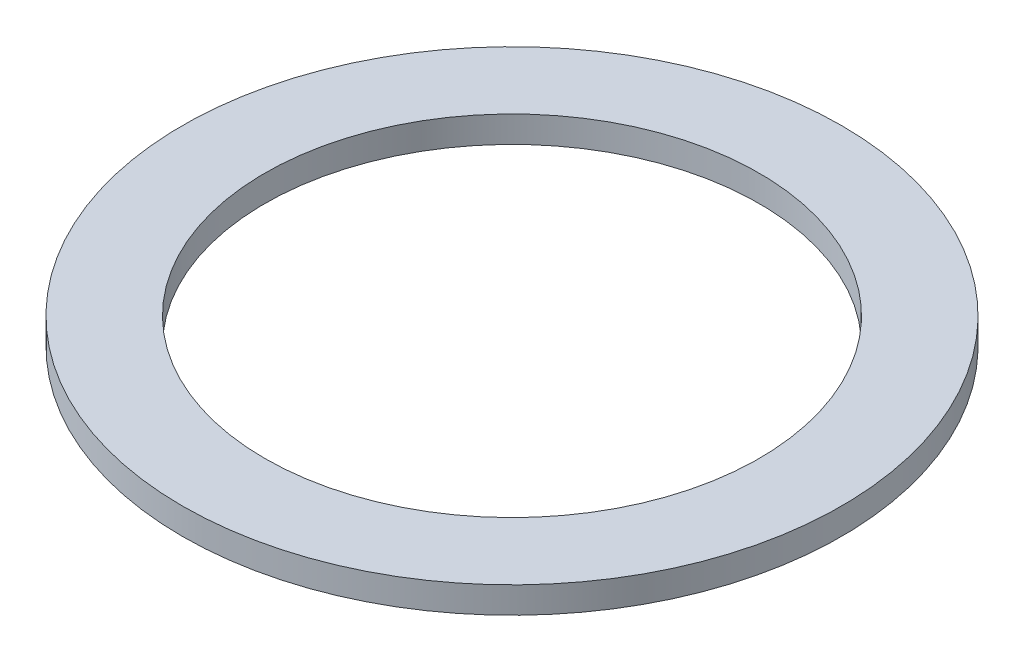
ISO-10303-21;
HEADER;
FILE_DESCRIPTION(('STEP AP214'),'2;1');
FILE_NAME('part.step','',(''),(''),'','','');
FILE_SCHEMA(('AUTOMOTIVE_DESIGN { 1 0 10303 214 1 1 1 1 }'));
ENDSEC;
DATA;
#1=APPLICATION_CONTEXT('core data for automotive mechanical design processes');
#2=APPLICATION_PROTOCOL_DEFINITION('international standard','automotive_design',2000,#1);
#3=PRODUCT_CONTEXT('',#1,'mechanical');
#4=PRODUCT('Part','Part','',(#3));
#5=PRODUCT_RELATED_PRODUCT_CATEGORY('part','',(#4));
#6=PRODUCT_DEFINITION_FORMATION('','',#4);
#7=PRODUCT_DEFINITION_CONTEXT('part definition',#1,'design');
#8=PRODUCT_DEFINITION('design','',#6,#7);
#9=PRODUCT_DEFINITION_SHAPE('','',#8);
#10=(LENGTH_UNIT() NAMED_UNIT(*) SI_UNIT(.MILLI.,.METRE.));
#11=(NAMED_UNIT(*) PLANE_ANGLE_UNIT() SI_UNIT($,.RADIAN.));
#12=(NAMED_UNIT(*) SI_UNIT($,.STERADIAN.) SOLID_ANGLE_UNIT());
#13=UNCERTAINTY_MEASURE_WITH_UNIT(LENGTH_MEASURE(1.E-05),#10,'distance_accuracy_value','');
#14=(GEOMETRIC_REPRESENTATION_CONTEXT(3) GLOBAL_UNCERTAINTY_ASSIGNED_CONTEXT((#13)) GLOBAL_UNIT_ASSIGNED_CONTEXT((#10,
#11,#12)) REPRESENTATION_CONTEXT('',''));
#15=CARTESIAN_POINT('',(0.,0.,0.));
#16=DIRECTION('',(0.,0.,1.));
#17=DIRECTION('',(1.,0.,0.));
#18=AXIS2_PLACEMENT_3D('',#15,#16,#17);
#19=CARTESIAN_POINT('',(0.,4.,0.));
#20=DIRECTION('',(0.,1.,0.));
#21=DIRECTION('',(0.,0.,1.));
#22=AXIS2_PLACEMENT_3D('',#19,#20,#21);
#23=PLANE('',#22);
#24=CARTESIAN_POINT('',(0.,4.,0.));
#25=DIRECTION('',(0.,1.,0.));
#26=DIRECTION('',(0.,0.,1.));
#27=AXIS2_PLACEMENT_3D('',#24,#25,#26);
#28=CIRCLE('',#27,50.);
#29=CARTESIAN_POINT('',(0.,4.,50.));
#30=VERTEX_POINT('',#29);
#31=EDGE_CURVE('E10',#30,#30,#28,.T.);
#32=ORIENTED_EDGE('',*,*,#31,.T.);
#33=EDGE_LOOP('',(#32));
#34=FACE_BOUND('',#33,.T.);
#35=CARTESIAN_POINT('',(0.,4.,0.));
#36=DIRECTION('',(0.,1.,0.));
#37=DIRECTION('',(0.,0.,1.));
#38=AXIS2_PLACEMENT_3D('',#35,#36,#37);
#39=CIRCLE('',#38,37.5);
#40=CARTESIAN_POINT('',(0.,4.,37.5));
#41=VERTEX_POINT('',#40);
#42=EDGE_CURVE('E56',#41,#41,#39,.T.);
#43=ORIENTED_EDGE('',*,*,#42,.F.);
#44=EDGE_LOOP('',(#43));
#45=FACE_BOUND('',#44,.T.);
#46=ADVANCED_FACE('F43',(#34,#45),#23,.T.);
#47=CARTESIAN_POINT('',(0.,0.,0.));
#48=DIRECTION('',(0.,1.,0.));
#49=DIRECTION('',(0.,0.,1.));
#50=AXIS2_PLACEMENT_3D('',#47,#48,#49);
#51=PLANE('',#50);
#52=CARTESIAN_POINT('',(0.,0.,0.));
#53=DIRECTION('',(0.,1.,0.));
#54=DIRECTION('',(0.,0.,1.));
#55=AXIS2_PLACEMENT_3D('',#52,#53,#54);
#56=CIRCLE('',#55,50.);
#57=CARTESIAN_POINT('',(0.,0.,50.));
#58=VERTEX_POINT('',#57);
#59=EDGE_CURVE('E47',#58,#58,#56,.T.);
#60=ORIENTED_EDGE('',*,*,#59,.F.);
#61=EDGE_LOOP('',(#60));
#62=FACE_BOUND('',#61,.T.);
#63=CARTESIAN_POINT('',(0.,0.,0.));
#64=DIRECTION('',(0.,1.,0.));
#65=DIRECTION('',(0.,0.,1.));
#66=AXIS2_PLACEMENT_3D('',#63,#64,#65);
#67=CIRCLE('',#66,37.5);
#68=CARTESIAN_POINT('',(0.,0.,37.5));
#69=VERTEX_POINT('',#68);
#70=EDGE_CURVE('E58',#69,#69,#67,.T.);
#71=ORIENTED_EDGE('',*,*,#70,.T.);
#72=EDGE_LOOP('',(#71));
#73=FACE_BOUND('',#72,.T.);
#74=ADVANCED_FACE('F70',(#62,#73),#51,.F.);
#75=CARTESIAN_POINT('',(0.,4.,0.));
#76=DIRECTION('',(0.,-1.,0.));
#77=DIRECTION('',(0.,0.,-1.));
#78=AXIS2_PLACEMENT_3D('',#75,#76,#77);
#79=CYLINDRICAL_SURFACE('',#78,50.);
#80=ORIENTED_EDGE('',*,*,#31,.F.);
#81=EDGE_LOOP('',(#80));
#82=FACE_BOUND('',#81,.T.);
#83=ORIENTED_EDGE('',*,*,#59,.T.);
#84=EDGE_LOOP('',(#83));
#85=FACE_BOUND('',#84,.T.);
#86=ADVANCED_FACE('F45',(#82,#85),#79,.T.);
#87=CARTESIAN_POINT('',(0.,4.,0.));
#88=DIRECTION('',(0.,-1.,0.));
#89=DIRECTION('',(0.,0.,-1.));
#90=AXIS2_PLACEMENT_3D('',#87,#88,#89);
#91=CYLINDRICAL_SURFACE('',#90,37.5);
#92=ORIENTED_EDGE('',*,*,#42,.T.);
#93=EDGE_LOOP('',(#92));
#94=FACE_BOUND('',#93,.T.);
#95=ORIENTED_EDGE('',*,*,#70,.F.);
#96=EDGE_LOOP('',(#95));
#97=FACE_BOUND('',#96,.T.);
#98=ADVANCED_FACE('F66',(#94,#97),#91,.F.);
#99=CLOSED_SHELL('',(#46,#74,#86,#98));
#100=MANIFOLD_SOLID_BREP('B2',#99);
#101=ADVANCED_BREP_SHAPE_REPRESENTATION('',(#18,#100),#14);
#102=SHAPE_DEFINITION_REPRESENTATION(#9,#101);
ENDSEC;
END-ISO-10303-21;
